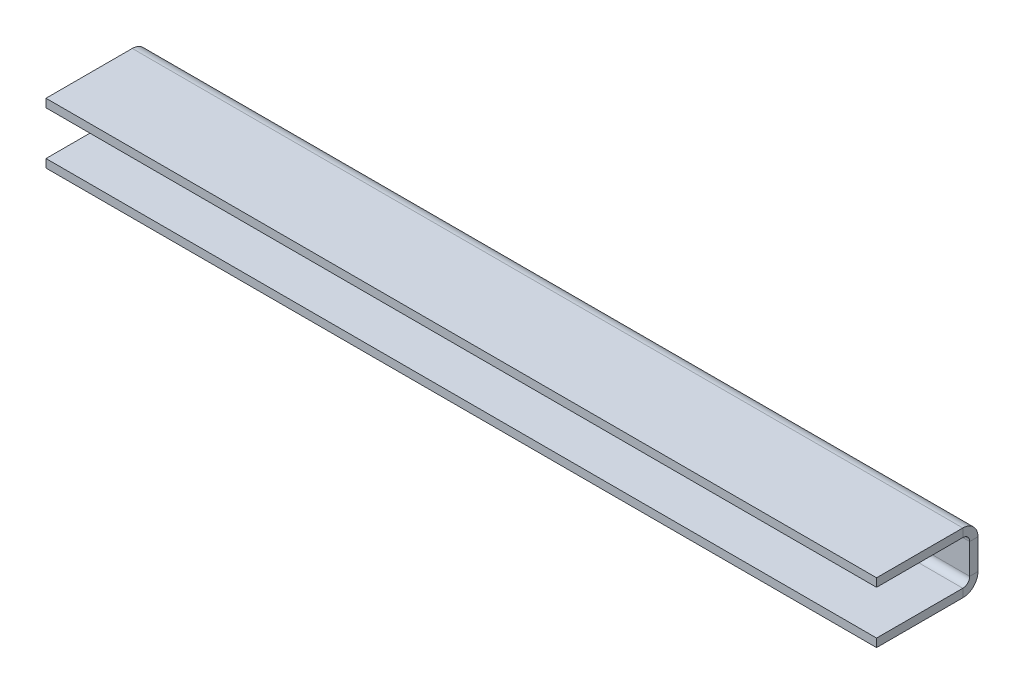
ISO-10303-21;
HEADER;
FILE_DESCRIPTION(('STEP AP214'),'2;1');
FILE_NAME('part.step','',(''),(''),'','','');
FILE_SCHEMA(('AUTOMOTIVE_DESIGN { 1 0 10303 214 1 1 1 1 }'));
ENDSEC;
DATA;
#1=APPLICATION_CONTEXT('core data for automotive mechanical design processes');
#2=APPLICATION_PROTOCOL_DEFINITION('international standard','automotive_design',2000,#1);
#3=PRODUCT_CONTEXT('',#1,'mechanical');
#4=PRODUCT('Part','Part','',(#3));
#5=PRODUCT_RELATED_PRODUCT_CATEGORY('part','',(#4));
#6=PRODUCT_DEFINITION_FORMATION('','',#4);
#7=PRODUCT_DEFINITION_CONTEXT('part definition',#1,'design');
#8=PRODUCT_DEFINITION('design','',#6,#7);
#9=PRODUCT_DEFINITION_SHAPE('','',#8);
#10=(LENGTH_UNIT() NAMED_UNIT(*) SI_UNIT(.MILLI.,.METRE.));
#11=(NAMED_UNIT(*) PLANE_ANGLE_UNIT() SI_UNIT($,.RADIAN.));
#12=(NAMED_UNIT(*) SI_UNIT($,.STERADIAN.) SOLID_ANGLE_UNIT());
#13=UNCERTAINTY_MEASURE_WITH_UNIT(LENGTH_MEASURE(1.E-05),#10,'distance_accuracy_value','');
#14=(GEOMETRIC_REPRESENTATION_CONTEXT(3) GLOBAL_UNCERTAINTY_ASSIGNED_CONTEXT((#13)) GLOBAL_UNIT_ASSIGNED_CONTEXT((#10,
#11,#12)) REPRESENTATION_CONTEXT('',''));
#15=CARTESIAN_POINT('',(0.,0.,0.));
#16=DIRECTION('',(0.,0.,1.));
#17=DIRECTION('',(1.,0.,0.));
#18=AXIS2_PLACEMENT_3D('',#15,#16,#17);
#19=CARTESIAN_POINT('',(0.,0.,0.));
#20=DIRECTION('',(0.,0.,-1.));
#21=DIRECTION('',(-1.,0.,0.));
#22=AXIS2_PLACEMENT_3D('',#19,#20,#21);
#23=PLANE('',#22);
#24=CARTESIAN_POINT('',(38.1,0.,0.));
#25=DIRECTION('',(0.,0.,-1.));
#26=DIRECTION('',(-1.,0.,0.));
#27=AXIS2_PLACEMENT_3D('',#24,#25,#26);
#28=CIRCLE('',#27,1.27);
#29=CARTESIAN_POINT('',(36.83,0.,0.));
#30=VERTEX_POINT('',#29);
#31=EDGE_CURVE('E314',#30,#30,#28,.T.);
#32=ORIENTED_EDGE('',*,*,#31,.T.);
#33=EDGE_LOOP('',(#32));
#34=FACE_BOUND('',#33,.T.);
#35=CARTESIAN_POINT('',(-38.1,0.,0.));
#36=DIRECTION('',(0.,0.,-1.));
#37=DIRECTION('',(-1.,0.,0.));
#38=AXIS2_PLACEMENT_3D('',#35,#36,#37);
#39=CIRCLE('',#38,1.27);
#40=CARTESIAN_POINT('',(-39.37,0.,0.));
#41=VERTEX_POINT('',#40);
#42=EDGE_CURVE('E179',#41,#41,#39,.T.);
#43=ORIENTED_EDGE('',*,*,#42,.T.);
#44=EDGE_LOOP('',(#43));
#45=FACE_BOUND('',#44,.T.);
#46=DIRECTION('',(0.,-1.,0.));
#47=VECTOR('',#46,1.);
#48=CARTESIAN_POINT('',(-44.45,-12.7,0.));
#49=LINE('',#48,#47);
#50=CARTESIAN_POINT('',(-44.45,1.61236622921128,0.));
#51=VERTEX_POINT('',#50);
#52=CARTESIAN_POINT('',(-44.45,-1.61236622921127,0.));
#53=VERTEX_POINT('',#52);
#54=EDGE_CURVE('E69',#51,#53,#49,.T.);
#55=ORIENTED_EDGE('',*,*,#54,.T.);
#56=DIRECTION('',(1.,0.,0.));
#57=VECTOR('',#56,1.);
#58=CARTESIAN_POINT('',(0.,-1.61236622921127,0.));
#59=LINE('',#58,#57);
#60=CARTESIAN_POINT('',(44.45,-1.61236622921127,0.));
#61=VERTEX_POINT('',#60);
#62=EDGE_CURVE('E61',#53,#61,#59,.T.);
#63=ORIENTED_EDGE('',*,*,#62,.T.);
#64=DIRECTION('',(0.,1.,0.));
#65=VECTOR('',#64,1.);
#66=CARTESIAN_POINT('',(44.45,-12.7,0.));
#67=LINE('',#66,#65);
#68=CARTESIAN_POINT('',(44.45,1.61236622921127,0.));
#69=VERTEX_POINT('',#68);
#70=EDGE_CURVE('E77',#61,#69,#67,.T.);
#71=ORIENTED_EDGE('',*,*,#70,.T.);
#72=DIRECTION('',(1.,0.,0.));
#73=VECTOR('',#72,1.);
#74=CARTESIAN_POINT('',(0.,1.61236622921127,0.));
#75=LINE('',#74,#73);
#76=EDGE_CURVE('E208',#51,#69,#75,.T.);
#77=ORIENTED_EDGE('',*,*,#76,.F.);
#78=EDGE_LOOP('',(#55,#63,#71,#77));
#79=FACE_BOUND('',#78,.T.);
#80=ADVANCED_FACE('F51',(#34,#45,#79),#23,.F.);
#81=CARTESIAN_POINT('',(0.,2.34896622921129,-2.73103377078873));
#82=DIRECTION('',(0.,1.,0.));
#83=DIRECTION('',(-1.,0.,0.));
#84=AXIS2_PLACEMENT_3D('',#81,#82,#83);
#85=PLANE('',#84);
#86=DIRECTION('',(0.,0.,-1.));
#87=VECTOR('',#86,1.);
#88=CARTESIAN_POINT('',(-44.45,2.34896622921133,-15.4310337707887));
#89=LINE('',#88,#87);
#90=CARTESIAN_POINT('',(-44.45,2.34896622921125,9.96896622921127));
#91=VERTEX_POINT('',#90);
#92=CARTESIAN_POINT('',(-44.45,2.34896622921128,0.736599999999996));
#93=VERTEX_POINT('',#92);
#94=EDGE_CURVE('E240',#91,#93,#89,.T.);
#95=ORIENTED_EDGE('',*,*,#94,.T.);
#96=DIRECTION('',(1.,0.,0.));
#97=VECTOR('',#96,1.);
#98=CARTESIAN_POINT('',(0.,2.34896622921128,0.736599999999997));
#99=LINE('',#98,#97);
#100=CARTESIAN_POINT('',(44.45,2.34896622921128,0.736599999999996));
#101=VERTEX_POINT('',#100);
#102=EDGE_CURVE('E257',#93,#101,#99,.T.);
#103=ORIENTED_EDGE('',*,*,#102,.T.);
#104=DIRECTION('',(0.,0.,1.));
#105=VECTOR('',#104,1.);
#106=CARTESIAN_POINT('',(44.45,2.34896622921133,-15.4310337707887));
#107=LINE('',#106,#105);
#108=CARTESIAN_POINT('',(44.45,2.34896622921125,9.96896622921127));
#109=VERTEX_POINT('',#108);
#110=EDGE_CURVE('E241',#101,#109,#107,.T.);
#111=ORIENTED_EDGE('',*,*,#110,.T.);
#112=DIRECTION('',(-1.,0.,0.));
#113=VECTOR('',#112,1.);
#114=CARTESIAN_POINT('',(-44.45,2.34896622921125,9.96896622921127));
#115=LINE('',#114,#113);
#116=EDGE_CURVE('E236',#109,#91,#115,.T.);
#117=ORIENTED_EDGE('',*,*,#116,.T.);
#118=EDGE_LOOP('',(#95,#103,#111,#117));
#119=FACE_BOUND('',#118,.T.);
#120=ADVANCED_FACE('F366',(#119),#85,.F.);
#121=CARTESIAN_POINT('',(44.45,3.23796622921133,-15.4310337707887));
#122=DIRECTION('',(1.,0.,0.));
#123=DIRECTION('',(0.,1.,0.));
#124=AXIS2_PLACEMENT_3D('',#121,#122,#123);
#125=PLANE('',#124);
#126=DIRECTION('',(0.,-1.,0.));
#127=VECTOR('',#126,1.);
#128=CARTESIAN_POINT('',(44.45,3.23796622921116,0.736600000000006));
#129=LINE('',#128,#127);
#130=CARTESIAN_POINT('',(44.45,3.23796622921128,0.736600000000009));
#131=VERTEX_POINT('',#130);
#132=EDGE_CURVE('E253',#131,#101,#129,.T.);
#133=ORIENTED_EDGE('',*,*,#132,.F.);
#134=DIRECTION('',(0.,0.,1.));
#135=VECTOR('',#134,1.);
#136=CARTESIAN_POINT('',(44.45,3.23796622921133,-15.4310337707887));
#137=LINE('',#136,#135);
#138=CARTESIAN_POINT('',(44.45,3.23796622921125,9.96896622921127));
#139=VERTEX_POINT('',#138);
#140=EDGE_CURVE('E235',#131,#139,#137,.T.);
#141=ORIENTED_EDGE('',*,*,#140,.T.);
#142=DIRECTION('',(0.,-1.,0.));
#143=VECTOR('',#142,1.);
#144=CARTESIAN_POINT('',(44.45,3.23796622921125,9.96896622921127));
#145=LINE('',#144,#143);
#146=EDGE_CURVE('E246',#139,#109,#145,.T.);
#147=ORIENTED_EDGE('',*,*,#146,.T.);
#148=ORIENTED_EDGE('',*,*,#110,.F.);
#149=EDGE_LOOP('',(#133,#141,#147,#148));
#150=FACE_BOUND('',#149,.T.);
#151=ADVANCED_FACE('F371',(#150),#125,.T.);
#152=CARTESIAN_POINT('',(-44.45,3.23796622921133,-15.4310337707887));
#153=DIRECTION('',(-1.,0.,0.));
#154=DIRECTION('',(0.,-1.,0.));
#155=AXIS2_PLACEMENT_3D('',#152,#153,#154);
#156=PLANE('',#155);
#157=DIRECTION('',(0.,1.,0.));
#158=VECTOR('',#157,1.);
#159=CARTESIAN_POINT('',(-44.45,3.23796622921116,0.736600000000006));
#160=LINE('',#159,#158);
#161=CARTESIAN_POINT('',(-44.45,3.23796622921128,0.736600000000006));
#162=VERTEX_POINT('',#161);
#163=EDGE_CURVE('E261',#93,#162,#160,.T.);
#164=ORIENTED_EDGE('',*,*,#163,.F.);
#165=ORIENTED_EDGE('',*,*,#94,.F.);
#166=DIRECTION('',(0.,-1.,0.));
#167=VECTOR('',#166,1.);
#168=CARTESIAN_POINT('',(-44.45,3.23796622921125,9.96896622921127));
#169=LINE('',#168,#167);
#170=CARTESIAN_POINT('',(-44.45,3.23796622921125,9.96896622921127));
#171=VERTEX_POINT('',#170);
#172=EDGE_CURVE('E242',#171,#91,#169,.T.);
#173=ORIENTED_EDGE('',*,*,#172,.F.);
#174=DIRECTION('',(0.,0.,-1.));
#175=VECTOR('',#174,1.);
#176=CARTESIAN_POINT('',(-44.45,3.23796622921133,-15.4310337707887));
#177=LINE('',#176,#175);
#178=EDGE_CURVE('E234',#171,#162,#177,.T.);
#179=ORIENTED_EDGE('',*,*,#178,.T.);
#180=EDGE_LOOP('',(#164,#165,#173,#179));
#181=FACE_BOUND('',#180,.T.);
#182=ADVANCED_FACE('F378',(#181),#156,.T.);
#183=CARTESIAN_POINT('',(-44.45,3.23796622921125,9.96896622921127));
#184=DIRECTION('',(0.,0.,1.));
#185=DIRECTION('',(0.,-1.,0.));
#186=AXIS2_PLACEMENT_3D('',#183,#184,#185);
#187=PLANE('',#186);
#188=ORIENTED_EDGE('',*,*,#116,.F.);
#189=ORIENTED_EDGE('',*,*,#146,.F.);
#190=DIRECTION('',(-1.,0.,0.));
#191=VECTOR('',#190,1.);
#192=CARTESIAN_POINT('',(-44.45,3.23796622921125,9.96896622921127));
#193=LINE('',#192,#191);
#194=EDGE_CURVE('E230',#139,#171,#193,.T.);
#195=ORIENTED_EDGE('',*,*,#194,.T.);
#196=ORIENTED_EDGE('',*,*,#172,.T.);
#197=EDGE_LOOP('',(#188,#189,#195,#196));
#198=FACE_BOUND('',#197,.T.);
#199=ADVANCED_FACE('F380',(#198),#187,.T.);
#200=CARTESIAN_POINT('',(0.,3.23796622921129,-2.73103377078873));
#201=DIRECTION('',(0.,1.,0.));
#202=DIRECTION('',(-1.,0.,0.));
#203=AXIS2_PLACEMENT_3D('',#200,#201,#202);
#204=PLANE('',#203);
#205=DIRECTION('',(1.,0.,0.));
#206=VECTOR('',#205,1.);
#207=CARTESIAN_POINT('',(0.,3.23796622921128,0.736600000000006));
#208=LINE('',#207,#206);
#209=EDGE_CURVE('E245',#162,#131,#208,.T.);
#210=ORIENTED_EDGE('',*,*,#209,.F.);
#211=ORIENTED_EDGE('',*,*,#178,.F.);
#212=ORIENTED_EDGE('',*,*,#194,.F.);
#213=ORIENTED_EDGE('',*,*,#140,.F.);
#214=EDGE_LOOP('',(#210,#211,#212,#213));
#215=FACE_BOUND('',#214,.T.);
#216=ADVANCED_FACE('F329',(#215),#204,.T.);
#217=CARTESIAN_POINT('',(0.,0.,-0.889));
#218=DIRECTION('',(0.,0.,-1.));
#219=DIRECTION('',(-1.,0.,0.));
#220=AXIS2_PLACEMENT_3D('',#217,#218,#219);
#221=PLANE('',#220);
#222=CARTESIAN_POINT('',(38.1,0.,-0.889));
#223=DIRECTION('',(0.,0.,-1.));
#224=DIRECTION('',(-1.,0.,0.));
#225=AXIS2_PLACEMENT_3D('',#222,#223,#224);
#226=CIRCLE('',#225,1.27);
#227=CARTESIAN_POINT('',(36.83,0.,-0.889));
#228=VERTEX_POINT('',#227);
#229=EDGE_CURVE('E318',#228,#228,#226,.T.);
#230=ORIENTED_EDGE('',*,*,#229,.F.);
#231=EDGE_LOOP('',(#230));
#232=FACE_BOUND('',#231,.T.);
#233=CARTESIAN_POINT('',(-38.1,0.,-0.889));
#234=DIRECTION('',(0.,0.,-1.));
#235=DIRECTION('',(-1.,0.,0.));
#236=AXIS2_PLACEMENT_3D('',#233,#234,#235);
#237=CIRCLE('',#236,1.27);
#238=CARTESIAN_POINT('',(-39.37,0.,-0.889));
#239=VERTEX_POINT('',#238);
#240=EDGE_CURVE('E310',#239,#239,#237,.T.);
#241=ORIENTED_EDGE('',*,*,#240,.F.);
#242=EDGE_LOOP('',(#241));
#243=FACE_BOUND('',#242,.T.);
#244=DIRECTION('',(1.,0.,0.));
#245=VECTOR('',#244,1.);
#246=CARTESIAN_POINT('',(0.,-1.61236622921127,-0.889));
#247=LINE('',#246,#245);
#248=CARTESIAN_POINT('',(-44.45,-1.61236622921127,-0.889));
#249=VERTEX_POINT('',#248);
#250=CARTESIAN_POINT('',(44.45,-1.61236622921127,-0.889));
#251=VERTEX_POINT('',#250);
#252=EDGE_CURVE('E265',#249,#251,#247,.T.);
#253=ORIENTED_EDGE('',*,*,#252,.F.);
#254=DIRECTION('',(0.,-1.,0.));
#255=VECTOR('',#254,1.);
#256=CARTESIAN_POINT('',(-44.45,-12.7,-0.889));
#257=LINE('',#256,#255);
#258=CARTESIAN_POINT('',(-44.45,1.61236622921128,-0.889));
#259=VERTEX_POINT('',#258);
#260=EDGE_CURVE('E219',#259,#249,#257,.T.);
#261=ORIENTED_EDGE('',*,*,#260,.F.);
#262=DIRECTION('',(1.,0.,0.));
#263=VECTOR('',#262,1.);
#264=CARTESIAN_POINT('',(0.,1.61236622921128,-0.889));
#265=LINE('',#264,#263);
#266=CARTESIAN_POINT('',(44.45,1.61236622921128,-0.889));
#267=VERTEX_POINT('',#266);
#268=EDGE_CURVE('E223',#259,#267,#265,.T.);
#269=ORIENTED_EDGE('',*,*,#268,.T.);
#270=DIRECTION('',(0.,1.,0.));
#271=VECTOR('',#270,1.);
#272=CARTESIAN_POINT('',(44.45,-12.7,-0.889));
#273=LINE('',#272,#271);
#274=EDGE_CURVE('E55',#251,#267,#273,.T.);
#275=ORIENTED_EDGE('',*,*,#274,.F.);
#276=EDGE_LOOP('',(#253,#261,#269,#275));
#277=FACE_BOUND('',#276,.T.);
#278=ADVANCED_FACE('F325',(#232,#243,#277),#221,.T.);
#279=CARTESIAN_POINT('',(44.45,-12.7,-0.889));
#280=DIRECTION('',(1.,0.,0.));
#281=DIRECTION('',(0.,0.,-1.));
#282=AXIS2_PLACEMENT_3D('',#279,#280,#281);
#283=PLANE('',#282);
#284=DIRECTION('',(0.,0.,1.));
#285=VECTOR('',#284,1.);
#286=CARTESIAN_POINT('',(44.45,-1.61236622921127,-0.888999999999923));
#287=LINE('',#286,#285);
#288=EDGE_CURVE('E278',#251,#61,#287,.T.);
#289=ORIENTED_EDGE('',*,*,#288,.F.);
#290=ORIENTED_EDGE('',*,*,#274,.T.);
#291=DIRECTION('',(0.,0.,1.));
#292=VECTOR('',#291,1.);
#293=CARTESIAN_POINT('',(44.45,1.61236622921128,-0.8889999999999));
#294=LINE('',#293,#292);
#295=EDGE_CURVE('E220',#267,#69,#294,.T.);
#296=ORIENTED_EDGE('',*,*,#295,.T.);
#297=ORIENTED_EDGE('',*,*,#70,.F.);
#298=EDGE_LOOP('',(#289,#290,#296,#297));
#299=FACE_BOUND('',#298,.T.);
#300=ADVANCED_FACE('F328',(#299),#283,.T.);
#301=CARTESIAN_POINT('',(-44.45,-12.7,-0.889));
#302=DIRECTION('',(-1.,0.,0.));
#303=DIRECTION('',(0.,0.,1.));
#304=AXIS2_PLACEMENT_3D('',#301,#302,#303);
#305=PLANE('',#304);
#306=DIRECTION('',(0.,0.,-1.));
#307=VECTOR('',#306,1.);
#308=CARTESIAN_POINT('',(-44.45,-1.61236622921127,-0.888999999999923));
#309=LINE('',#308,#307);
#310=EDGE_CURVE('E12',#53,#249,#309,.T.);
#311=ORIENTED_EDGE('',*,*,#310,.F.);
#312=ORIENTED_EDGE('',*,*,#54,.F.);
#313=DIRECTION('',(0.,0.,-1.));
#314=VECTOR('',#313,1.);
#315=CARTESIAN_POINT('',(-44.45,1.61236622921128,-0.8889999999999));
#316=LINE('',#315,#314);
#317=EDGE_CURVE('E215',#51,#259,#316,.T.);
#318=ORIENTED_EDGE('',*,*,#317,.T.);
#319=ORIENTED_EDGE('',*,*,#260,.T.);
#320=EDGE_LOOP('',(#311,#312,#318,#319));
#321=FACE_BOUND('',#320,.T.);
#322=ADVANCED_FACE('F53',(#321),#305,.T.);
#323=CARTESIAN_POINT('',(-44.45,1.61236622921128,0.7366));
#324=DIRECTION('',(-1.,0.,0.));
#325=DIRECTION('',(0.,0.,1.));
#326=AXIS2_PLACEMENT_3D('',#323,#324,#325);
#327=PLANE('',#326);
#328=ORIENTED_EDGE('',*,*,#317,.F.);
#329=CARTESIAN_POINT('',(-44.45,1.61236622921128,0.7366));
#330=DIRECTION('',(1.,0.,0.));
#331=DIRECTION('',(0.,0.,-1.));
#332=AXIS2_PLACEMENT_3D('',#329,#330,#331);
#333=CIRCLE('',#332,0.7366);
#334=EDGE_CURVE('E192',#51,#93,#333,.T.);
#335=ORIENTED_EDGE('',*,*,#334,.T.);
#336=ORIENTED_EDGE('',*,*,#163,.T.);
#337=CARTESIAN_POINT('',(-44.45,1.61236622921128,0.7366));
#338=DIRECTION('',(1.,0.,0.));
#339=DIRECTION('',(0.,0.,1.));
#340=AXIS2_PLACEMENT_3D('',#337,#338,#339);
#341=CIRCLE('',#340,1.6256);
#342=EDGE_CURVE('E199',#259,#162,#341,.T.);
#343=ORIENTED_EDGE('',*,*,#342,.F.);
#344=EDGE_LOOP('',(#328,#335,#336,#343));
#345=FACE_BOUND('',#344,.T.);
#346=ADVANCED_FACE('F396',(#345),#327,.T.);
#347=CARTESIAN_POINT('',(44.45,1.61236622921128,0.7366));
#348=DIRECTION('',(1.,0.,0.));
#349=DIRECTION('',(0.,0.,-1.));
#350=AXIS2_PLACEMENT_3D('',#347,#348,#349);
#351=PLANE('',#350);
#352=CARTESIAN_POINT('',(44.45,1.61236622921128,0.7366));
#353=DIRECTION('',(1.,0.,0.));
#354=DIRECTION('',(0.,0.,-1.));
#355=AXIS2_PLACEMENT_3D('',#352,#353,#354);
#356=CIRCLE('',#355,0.7366);
#357=EDGE_CURVE('E204',#101,#69,#356,.F.);
#358=ORIENTED_EDGE('',*,*,#357,.T.);
#359=ORIENTED_EDGE('',*,*,#295,.F.);
#360=CARTESIAN_POINT('',(44.45,1.61236622921128,0.7366));
#361=DIRECTION('',(-1.,0.,0.));
#362=DIRECTION('',(0.,0.,-1.));
#363=AXIS2_PLACEMENT_3D('',#360,#361,#362);
#364=CIRCLE('',#363,1.6256);
#365=EDGE_CURVE('E203',#131,#267,#364,.T.);
#366=ORIENTED_EDGE('',*,*,#365,.F.);
#367=ORIENTED_EDGE('',*,*,#132,.T.);
#368=EDGE_LOOP('',(#358,#359,#366,#367));
#369=FACE_BOUND('',#368,.T.);
#370=ADVANCED_FACE('F392',(#369),#351,.T.);
#371=CARTESIAN_POINT('',(-88.923800743394,1.61236622921128,0.7366));
#372=DIRECTION('',(1.,0.,0.));
#373=DIRECTION('',(0.,0.,-1.));
#374=AXIS2_PLACEMENT_3D('',#371,#372,#373);
#375=CYLINDRICAL_SURFACE('',#374,1.6256);
#376=ORIENTED_EDGE('',*,*,#209,.T.);
#377=ORIENTED_EDGE('',*,*,#365,.T.);
#378=ORIENTED_EDGE('',*,*,#268,.F.);
#379=ORIENTED_EDGE('',*,*,#342,.T.);
#380=EDGE_LOOP('',(#376,#377,#378,#379));
#381=FACE_BOUND('',#380,.T.);
#382=ADVANCED_FACE('F395',(#381),#375,.T.);
#383=CARTESIAN_POINT('',(-88.923800743394,1.61236622921128,0.7366));
#384=DIRECTION('',(1.,0.,0.));
#385=DIRECTION('',(0.,0.,-1.));
#386=AXIS2_PLACEMENT_3D('',#383,#384,#385);
#387=CYLINDRICAL_SURFACE('',#386,0.7366);
#388=ORIENTED_EDGE('',*,*,#102,.F.);
#389=ORIENTED_EDGE('',*,*,#334,.F.);
#390=ORIENTED_EDGE('',*,*,#76,.T.);
#391=ORIENTED_EDGE('',*,*,#357,.F.);
#392=EDGE_LOOP('',(#388,#389,#390,#391));
#393=FACE_BOUND('',#392,.T.);
#394=ADVANCED_FACE('F401',(#393),#387,.F.);
#395=CARTESIAN_POINT('',(-44.45,-1.61236622921127,0.7366));
#396=DIRECTION('',(-1.,0.,0.));
#397=DIRECTION('',(0.,0.,1.));
#398=AXIS2_PLACEMENT_3D('',#395,#396,#397);
#399=PLANE('',#398);
#400=DIRECTION('',(0.,-1.,0.));
#401=VECTOR('',#400,1.);
#402=CARTESIAN_POINT('',(-44.45,-3.2379662292112,0.736600000000004));
#403=LINE('',#402,#401);
#404=CARTESIAN_POINT('',(-44.45,-2.34896622921127,0.736600000000008));
#405=VERTEX_POINT('',#404);
#406=CARTESIAN_POINT('',(-44.45,-3.23796622921127,0.736600000000002));
#407=VERTEX_POINT('',#406);
#408=EDGE_CURVE('E151',#405,#407,#403,.T.);
#409=ORIENTED_EDGE('',*,*,#408,.F.);
#410=CARTESIAN_POINT('',(-44.45,-1.61236622921127,0.7366));
#411=DIRECTION('',(-1.,0.,0.));
#412=DIRECTION('',(0.,-1.,0.));
#413=AXIS2_PLACEMENT_3D('',#410,#411,#412);
#414=CIRCLE('',#413,0.7366);
#415=EDGE_CURVE('E164',#405,#53,#414,.F.);
#416=ORIENTED_EDGE('',*,*,#415,.T.);
#417=ORIENTED_EDGE('',*,*,#310,.T.);
#418=CARTESIAN_POINT('',(-44.45,-1.61236622921127,0.7366));
#419=DIRECTION('',(1.,0.,0.));
#420=DIRECTION('',(0.,0.,1.));
#421=AXIS2_PLACEMENT_3D('',#418,#419,#420);
#422=CIRCLE('',#421,1.6256);
#423=EDGE_CURVE('E183',#407,#249,#422,.T.);
#424=ORIENTED_EDGE('',*,*,#423,.F.);
#425=EDGE_LOOP('',(#409,#416,#417,#424));
#426=FACE_BOUND('',#425,.T.);
#427=ADVANCED_FACE('F339',(#426),#399,.T.);
#428=CARTESIAN_POINT('',(44.45,-1.61236622921127,0.7366));
#429=DIRECTION('',(1.,0.,0.));
#430=DIRECTION('',(0.,0.,-1.));
#431=AXIS2_PLACEMENT_3D('',#428,#429,#430);
#432=PLANE('',#431);
#433=CARTESIAN_POINT('',(44.45,-1.61236622921127,0.7366));
#434=DIRECTION('',(-1.,0.,0.));
#435=DIRECTION('',(0.,-1.,0.));
#436=AXIS2_PLACEMENT_3D('',#433,#434,#435);
#437=CIRCLE('',#436,0.7366);
#438=CARTESIAN_POINT('',(44.45,-2.34896622921127,0.736600000000007));
#439=VERTEX_POINT('',#438);
#440=EDGE_CURVE('E188',#61,#439,#437,.T.);
#441=ORIENTED_EDGE('',*,*,#440,.T.);
#442=DIRECTION('',(0.,1.,0.));
#443=VECTOR('',#442,1.);
#444=CARTESIAN_POINT('',(44.45,-3.2379662292112,0.736600000000003));
#445=LINE('',#444,#443);
#446=CARTESIAN_POINT('',(44.45,-3.23796622921127,0.736600000000005));
#447=VERTEX_POINT('',#446);
#448=EDGE_CURVE('E299',#447,#439,#445,.T.);
#449=ORIENTED_EDGE('',*,*,#448,.F.);
#450=CARTESIAN_POINT('',(44.45,-1.61236622921127,0.7366));
#451=DIRECTION('',(-1.,0.,0.));
#452=DIRECTION('',(0.,0.,-1.));
#453=AXIS2_PLACEMENT_3D('',#450,#451,#452);
#454=CIRCLE('',#453,1.6256);
#455=EDGE_CURVE('E187',#251,#447,#454,.T.);
#456=ORIENTED_EDGE('',*,*,#455,.F.);
#457=ORIENTED_EDGE('',*,*,#288,.T.);
#458=EDGE_LOOP('',(#441,#449,#456,#457));
#459=FACE_BOUND('',#458,.T.);
#460=ADVANCED_FACE('F346',(#459),#432,.T.);
#461=CARTESIAN_POINT('',(88.923800743394,-1.61236622921127,0.7366));
#462=DIRECTION('',(-1.,0.,0.));
#463=DIRECTION('',(0.,-1.,0.));
#464=AXIS2_PLACEMENT_3D('',#461,#462,#463);
#465=CYLINDRICAL_SURFACE('',#464,1.6256);
#466=ORIENTED_EDGE('',*,*,#252,.T.);
#467=ORIENTED_EDGE('',*,*,#455,.T.);
#468=DIRECTION('',(1.,0.,0.));
#469=VECTOR('',#468,1.);
#470=CARTESIAN_POINT('',(0.,-3.23796622921127,0.736600000000005));
#471=LINE('',#470,#469);
#472=EDGE_CURVE('E176',#407,#447,#471,.T.);
#473=ORIENTED_EDGE('',*,*,#472,.F.);
#474=ORIENTED_EDGE('',*,*,#423,.T.);
#475=EDGE_LOOP('',(#466,#467,#473,#474));
#476=FACE_BOUND('',#475,.T.);
#477=ADVANCED_FACE('F343',(#476),#465,.T.);
#478=CARTESIAN_POINT('',(88.923800743394,-1.61236622921127,0.7366));
#479=DIRECTION('',(-1.,0.,0.));
#480=DIRECTION('',(0.,-1.,0.));
#481=AXIS2_PLACEMENT_3D('',#478,#479,#480);
#482=CYLINDRICAL_SURFACE('',#481,0.7366);
#483=ORIENTED_EDGE('',*,*,#62,.F.);
#484=ORIENTED_EDGE('',*,*,#415,.F.);
#485=DIRECTION('',(1.,0.,0.));
#486=VECTOR('',#485,1.);
#487=CARTESIAN_POINT('',(0.,-2.34896622921127,0.736600000000008));
#488=LINE('',#487,#486);
#489=EDGE_CURVE('E172',#405,#439,#488,.T.);
#490=ORIENTED_EDGE('',*,*,#489,.T.);
#491=ORIENTED_EDGE('',*,*,#440,.F.);
#492=EDGE_LOOP('',(#483,#484,#490,#491));
#493=FACE_BOUND('',#492,.T.);
#494=ADVANCED_FACE('F353',(#493),#482,.F.);
#495=CARTESIAN_POINT('',(-44.45,-3.23796622921123,9.96896622921128));
#496=DIRECTION('',(0.,0.,1.));
#497=DIRECTION('',(0.,-1.,0.));
#498=AXIS2_PLACEMENT_3D('',#495,#496,#497);
#499=PLANE('',#498);
#500=DIRECTION('',(1.,0.,0.));
#501=VECTOR('',#500,1.);
#502=CARTESIAN_POINT('',(-44.45,-2.34896622921123,9.96896622921128));
#503=LINE('',#502,#501);
#504=CARTESIAN_POINT('',(-44.45,-2.34896622921123,9.96896622921128));
#505=VERTEX_POINT('',#504);
#506=CARTESIAN_POINT('',(44.45,-2.34896622921123,9.96896622921128));
#507=VERTEX_POINT('',#506);
#508=EDGE_CURVE('E162',#505,#507,#503,.T.);
#509=ORIENTED_EDGE('',*,*,#508,.F.);
#510=DIRECTION('',(0.,1.,0.));
#511=VECTOR('',#510,1.);
#512=CARTESIAN_POINT('',(-44.45,-3.23796622921123,9.96896622921128));
#513=LINE('',#512,#511);
#514=CARTESIAN_POINT('',(-44.45,-3.23796622921123,9.96896622921128));
#515=VERTEX_POINT('',#514);
#516=EDGE_CURVE('E148',#515,#505,#513,.T.);
#517=ORIENTED_EDGE('',*,*,#516,.F.);
#518=DIRECTION('',(1.,0.,0.));
#519=VECTOR('',#518,1.);
#520=CARTESIAN_POINT('',(-44.45,-3.23796622921123,9.96896622921128));
#521=LINE('',#520,#519);
#522=CARTESIAN_POINT('',(44.45,-3.23796622921123,9.96896622921128));
#523=VERTEX_POINT('',#522);
#524=EDGE_CURVE('E160',#515,#523,#521,.T.);
#525=ORIENTED_EDGE('',*,*,#524,.T.);
#526=DIRECTION('',(0.,1.,0.));
#527=VECTOR('',#526,1.);
#528=CARTESIAN_POINT('',(44.45,-3.23796622921123,9.96896622921128));
#529=LINE('',#528,#527);
#530=EDGE_CURVE('E171',#523,#507,#529,.T.);
#531=ORIENTED_EDGE('',*,*,#530,.T.);
#532=EDGE_LOOP('',(#509,#517,#525,#531));
#533=FACE_BOUND('',#532,.T.);
#534=ADVANCED_FACE('F159',(#533),#499,.T.);
#535=CARTESIAN_POINT('',(0.,-3.23796622921128,-2.73103377078872));
#536=DIRECTION('',(0.,-1.,0.));
#537=DIRECTION('',(-1.,0.,0.));
#538=AXIS2_PLACEMENT_3D('',#535,#536,#537);
#539=PLANE('',#538);
#540=DIRECTION('',(0.,0.,1.));
#541=VECTOR('',#540,1.);
#542=CARTESIAN_POINT('',(-44.45,-3.23796622921123,9.96896622921128));
#543=LINE('',#542,#541);
#544=EDGE_CURVE('E145',#407,#515,#543,.T.);
#545=ORIENTED_EDGE('',*,*,#544,.F.);
#546=ORIENTED_EDGE('',*,*,#472,.T.);
#547=DIRECTION('',(0.,0.,-1.));
#548=VECTOR('',#547,1.);
#549=CARTESIAN_POINT('',(44.45,-3.23796622921123,9.96896622921128));
#550=LINE('',#549,#548);
#551=EDGE_CURVE('E169',#523,#447,#550,.T.);
#552=ORIENTED_EDGE('',*,*,#551,.F.);
#553=ORIENTED_EDGE('',*,*,#524,.F.);
#554=EDGE_LOOP('',(#545,#546,#552,#553));
#555=FACE_BOUND('',#554,.T.);
#556=ADVANCED_FACE('F167',(#555),#539,.T.);
#557=CARTESIAN_POINT('',(44.45,-3.23796622921123,9.96896622921128));
#558=DIRECTION('',(1.,0.,0.));
#559=DIRECTION('',(0.,-1.,0.));
#560=AXIS2_PLACEMENT_3D('',#557,#558,#559);
#561=PLANE('',#560);
#562=ORIENTED_EDGE('',*,*,#551,.T.);
#563=ORIENTED_EDGE('',*,*,#448,.T.);
#564=DIRECTION('',(0.,0.,-1.));
#565=VECTOR('',#564,1.);
#566=CARTESIAN_POINT('',(44.45,-2.34896622921123,9.96896622921128));
#567=LINE('',#566,#565);
#568=EDGE_CURVE('E291',#507,#439,#567,.T.);
#569=ORIENTED_EDGE('',*,*,#568,.F.);
#570=ORIENTED_EDGE('',*,*,#530,.F.);
#571=EDGE_LOOP('',(#562,#563,#569,#570));
#572=FACE_BOUND('',#571,.T.);
#573=ADVANCED_FACE('F350',(#572),#561,.T.);
#574=CARTESIAN_POINT('',(0.,-2.34896622921128,-2.73103377078872));
#575=DIRECTION('',(0.,-1.,0.));
#576=DIRECTION('',(-1.,0.,0.));
#577=AXIS2_PLACEMENT_3D('',#574,#575,#576);
#578=PLANE('',#577);
#579=ORIENTED_EDGE('',*,*,#489,.F.);
#580=DIRECTION('',(0.,0.,1.));
#581=VECTOR('',#580,1.);
#582=CARTESIAN_POINT('',(-44.45,-2.34896622921123,9.96896622921128));
#583=LINE('',#582,#581);
#584=EDGE_CURVE('E296',#405,#505,#583,.T.);
#585=ORIENTED_EDGE('',*,*,#584,.T.);
#586=ORIENTED_EDGE('',*,*,#508,.T.);
#587=ORIENTED_EDGE('',*,*,#568,.T.);
#588=EDGE_LOOP('',(#579,#585,#586,#587));
#589=FACE_BOUND('',#588,.T.);
#590=ADVANCED_FACE('F355',(#589),#578,.F.);
#591=CARTESIAN_POINT('',(-44.45,-3.23796622921123,9.96896622921128));
#592=DIRECTION('',(-1.,0.,0.));
#593=DIRECTION('',(0.,1.,0.));
#594=AXIS2_PLACEMENT_3D('',#591,#592,#593);
#595=PLANE('',#594);
#596=ORIENTED_EDGE('',*,*,#584,.F.);
#597=ORIENTED_EDGE('',*,*,#408,.T.);
#598=ORIENTED_EDGE('',*,*,#544,.T.);
#599=ORIENTED_EDGE('',*,*,#516,.T.);
#600=EDGE_LOOP('',(#596,#597,#598,#599));
#601=FACE_BOUND('',#600,.T.);
#602=ADVANCED_FACE('F147',(#601),#595,.T.);
#603=CARTESIAN_POINT('',(-38.1,0.,-0.889));
#604=DIRECTION('',(0.,0.,-1.));
#605=DIRECTION('',(-1.,0.,0.));
#606=AXIS2_PLACEMENT_3D('',#603,#604,#605);
#607=CYLINDRICAL_SURFACE('',#606,1.27);
#608=ORIENTED_EDGE('',*,*,#42,.F.);
#609=EDGE_LOOP('',(#608));
#610=FACE_BOUND('',#609,.T.);
#611=ORIENTED_EDGE('',*,*,#240,.T.);
#612=EDGE_LOOP('',(#611));
#613=FACE_BOUND('',#612,.T.);
#614=ADVANCED_FACE('F362',(#610,#613),#607,.F.);
#615=CARTESIAN_POINT('',(38.1,0.,-0.889));
#616=DIRECTION('',(0.,0.,-1.));
#617=DIRECTION('',(-1.,0.,0.));
#618=AXIS2_PLACEMENT_3D('',#615,#616,#617);
#619=CYLINDRICAL_SURFACE('',#618,1.27);
#620=ORIENTED_EDGE('',*,*,#31,.F.);
#621=EDGE_LOOP('',(#620));
#622=FACE_BOUND('',#621,.T.);
#623=ORIENTED_EDGE('',*,*,#229,.T.);
#624=EDGE_LOOP('',(#623));
#625=FACE_BOUND('',#624,.T.);
#626=ADVANCED_FACE('F323',(#622,#625),#619,.F.);
#627=CLOSED_SHELL('',(#80,#120,#151,#182,#199,#216,#278,#300,#322,#346,#370,#382,#394,#427,#460,
#477,#494,#534,#556,#573,#590,#602,#614,#626));
#628=MANIFOLD_SOLID_BREP('B2',#627);
#629=ADVANCED_BREP_SHAPE_REPRESENTATION('',(#18,#628),#14);
#630=SHAPE_DEFINITION_REPRESENTATION(#9,#629);
ENDSEC;
END-ISO-10303-21;
